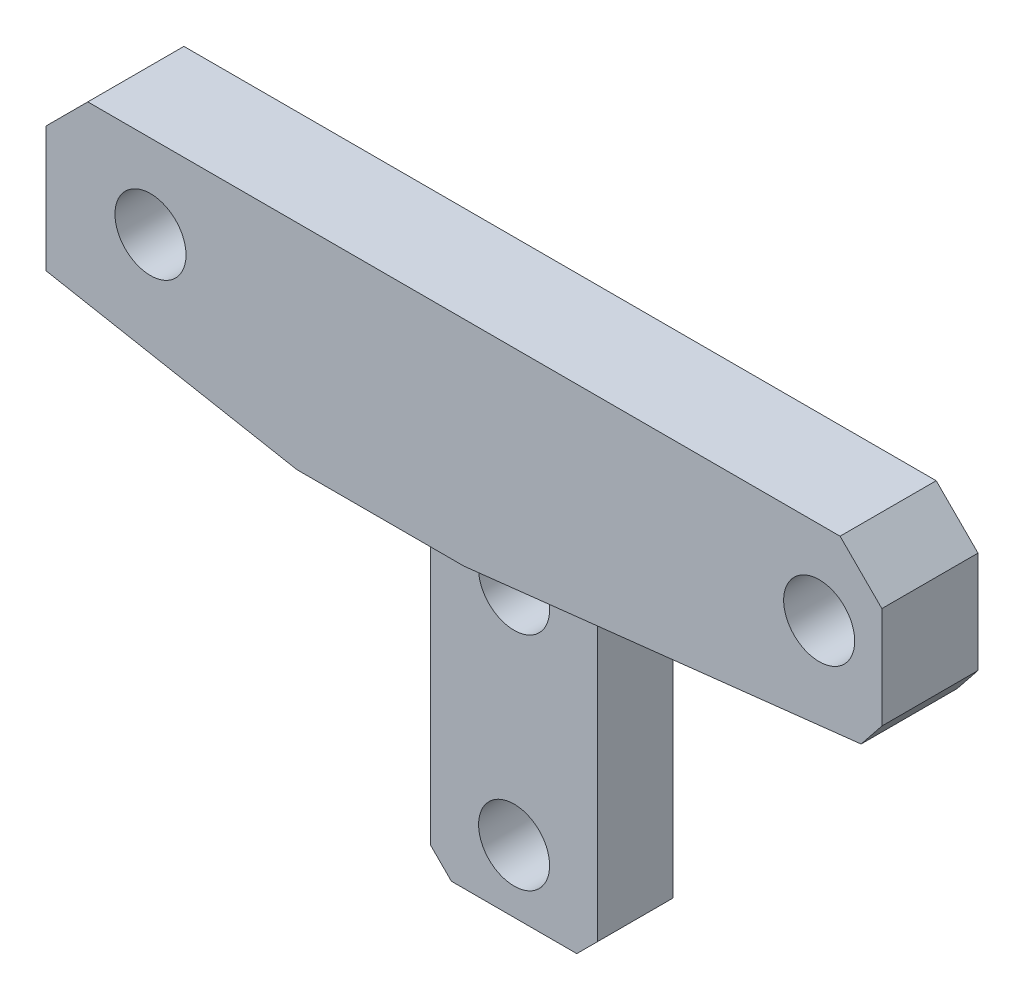
ISO-10303-21;
HEADER;
FILE_DESCRIPTION(('STEP AP214'),'2;1');
FILE_NAME('part.step','',(''),(''),'','','');
FILE_SCHEMA(('AUTOMOTIVE_DESIGN { 1 0 10303 214 1 1 1 1 }'));
ENDSEC;
DATA;
#1=APPLICATION_CONTEXT('core data for automotive mechanical design processes');
#2=APPLICATION_PROTOCOL_DEFINITION('international standard','automotive_design',2000,#1);
#3=PRODUCT_CONTEXT('',#1,'mechanical');
#4=PRODUCT('Part','Part','',(#3));
#5=PRODUCT_RELATED_PRODUCT_CATEGORY('part','',(#4));
#6=PRODUCT_DEFINITION_FORMATION('','',#4);
#7=PRODUCT_DEFINITION_CONTEXT('part definition',#1,'design');
#8=PRODUCT_DEFINITION('design','',#6,#7);
#9=PRODUCT_DEFINITION_SHAPE('','',#8);
#10=(LENGTH_UNIT() NAMED_UNIT(*) SI_UNIT(.MILLI.,.METRE.));
#11=(NAMED_UNIT(*) PLANE_ANGLE_UNIT() SI_UNIT($,.RADIAN.));
#12=(NAMED_UNIT(*) SI_UNIT($,.STERADIAN.) SOLID_ANGLE_UNIT());
#13=UNCERTAINTY_MEASURE_WITH_UNIT(LENGTH_MEASURE(1.E-05),#10,'distance_accuracy_value','');
#14=(GEOMETRIC_REPRESENTATION_CONTEXT(3) GLOBAL_UNCERTAINTY_ASSIGNED_CONTEXT((#13)) GLOBAL_UNIT_ASSIGNED_CONTEXT((#10,
#11,#12)) REPRESENTATION_CONTEXT('',''));
#15=CARTESIAN_POINT('',(0.,0.,0.));
#16=DIRECTION('',(0.,0.,1.));
#17=DIRECTION('',(1.,0.,0.));
#18=AXIS2_PLACEMENT_3D('',#15,#16,#17);
#19=CARTESIAN_POINT('',(0.,-3.12,5.5));
#20=DIRECTION('',(-0.111304076447319,0.993786396851059,0.));
#21=DIRECTION('',(-0.993786396851058,-0.111304076447319,0.));
#22=AXIS2_PLACEMENT_3D('',#19,#20,#21);
#23=PLANE('',#22);
#24=DIRECTION('',(-0.993786396851058,-0.111304076447319,0.));
#25=VECTOR('',#24,1.);
#26=CARTESIAN_POINT('',(5.53571428571428,-2.5,0.5));
#27=LINE('',#26,#25);
#28=CARTESIAN_POINT('',(5.53571428571428,-2.5,0.5));
#29=VERTEX_POINT('',#28);
#30=CARTESIAN_POINT('',(0.,-3.12,0.5));
#31=VERTEX_POINT('',#30);
#32=EDGE_CURVE('E280',#29,#31,#27,.T.);
#33=ORIENTED_EDGE('',*,*,#32,.F.);
#34=DIRECTION('',(0.,0.,-1.));
#35=VECTOR('',#34,1.);
#36=CARTESIAN_POINT('',(5.53571428571428,-2.5,5.5));
#37=LINE('',#36,#35);
#38=CARTESIAN_POINT('',(5.53571428571428,-2.5,3.2));
#39=VERTEX_POINT('',#38);
#40=EDGE_CURVE('E253',#39,#29,#37,.T.);
#41=ORIENTED_EDGE('',*,*,#40,.F.);
#42=DIRECTION('',(0.993786396851058,0.111304076447319,0.));
#43=VECTOR('',#42,1.);
#44=CARTESIAN_POINT('',(0.,-3.12,3.2));
#45=LINE('',#44,#43);
#46=CARTESIAN_POINT('',(9.50310680157448,-2.05565203822366,3.2));
#47=VERTEX_POINT('',#46);
#48=EDGE_CURVE('E244',#39,#47,#45,.T.);
#49=ORIENTED_EDGE('',*,*,#48,.T.);
#50=DIRECTION('',(0.,0.,1.));
#51=VECTOR('',#50,1.);
#52=CARTESIAN_POINT('',(9.50310680157448,-2.05565203822366,5.5));
#53=LINE('',#52,#51);
#54=CARTESIAN_POINT('',(9.50310680157448,-2.05565203822366,5.5));
#55=VERTEX_POINT('',#54);
#56=EDGE_CURVE('E54',#47,#55,#53,.T.);
#57=ORIENTED_EDGE('',*,*,#56,.T.);
#58=DIRECTION('',(0.993786396851058,0.111304076447319,0.));
#59=VECTOR('',#58,1.);
#60=CARTESIAN_POINT('',(0.,-3.12,5.5));
#61=LINE('',#60,#59);
#62=CARTESIAN_POINT('',(0.,-3.12,5.5));
#63=VERTEX_POINT('',#62);
#64=EDGE_CURVE('E262',#63,#55,#61,.T.);
#65=ORIENTED_EDGE('',*,*,#64,.F.);
#66=DIRECTION('',(0.,0.,-1.));
#67=VECTOR('',#66,1.);
#68=CARTESIAN_POINT('',(0.,-3.12,5.5));
#69=LINE('',#68,#67);
#70=CARTESIAN_POINT('',(0.,-3.12,3.30000000000001));
#71=VERTEX_POINT('',#70);
#72=EDGE_CURVE('E187',#63,#71,#69,.T.);
#73=ORIENTED_EDGE('',*,*,#72,.T.);
#74=EDGE_CURVE('E191',#71,#31,#69,.T.);
#75=ORIENTED_EDGE('',*,*,#74,.T.);
#76=EDGE_LOOP('',(#33,#41,#49,#57,#65,#73,#75));
#77=FACE_BOUND('',#76,.T.);
#78=ADVANCED_FACE('F45',(#77),#23,.F.);
#79=CARTESIAN_POINT('',(-9.99999999999999,-2.,5.5));
#80=DIRECTION('',(0.183497113102886,0.98302024876546,0.));
#81=DIRECTION('',(-0.98302024876546,0.183497113102886,0.));
#82=AXIS2_PLACEMENT_3D('',#79,#80,#81);
#83=PLANE('',#82);
#84=DIRECTION('',(-0.98302024876546,0.183497113102886,0.));
#85=VECTOR('',#84,1.);
#86=CARTESIAN_POINT('',(-4.,-3.12,0.5));
#87=LINE('',#86,#85);
#88=CARTESIAN_POINT('',(-4.,-3.12,0.5));
#89=VERTEX_POINT('',#88);
#90=CARTESIAN_POINT('',(-7.32142857142856,-2.5,0.5));
#91=VERTEX_POINT('',#90);
#92=EDGE_CURVE('E61',#89,#91,#87,.T.);
#93=ORIENTED_EDGE('',*,*,#92,.F.);
#94=DIRECTION('',(0.,0.,-1.));
#95=VECTOR('',#94,1.);
#96=CARTESIAN_POINT('',(-4.,-3.12,5.5));
#97=LINE('',#96,#95);
#98=CARTESIAN_POINT('',(-4.,-3.12,3.30000000000001));
#99=VERTEX_POINT('',#98);
#100=EDGE_CURVE('E175',#99,#89,#97,.T.);
#101=ORIENTED_EDGE('',*,*,#100,.F.);
#102=CARTESIAN_POINT('',(-4.,-3.12,5.5));
#103=VERTEX_POINT('',#102);
#104=EDGE_CURVE('E186',#103,#99,#97,.T.);
#105=ORIENTED_EDGE('',*,*,#104,.F.);
#106=DIRECTION('',(0.98302024876546,-0.183497113102886,0.));
#107=VECTOR('',#106,1.);
#108=CARTESIAN_POINT('',(-9.99999999999999,-2.,5.5));
#109=LINE('',#108,#107);
#110=CARTESIAN_POINT('',(-9.99999999999999,-2.,5.5));
#111=VERTEX_POINT('',#110);
#112=EDGE_CURVE('E276',#111,#103,#109,.T.);
#113=ORIENTED_EDGE('',*,*,#112,.F.);
#114=DIRECTION('',(0.,0.,-1.));
#115=VECTOR('',#114,1.);
#116=CARTESIAN_POINT('',(-9.99999999999999,-2.,5.5));
#117=LINE('',#116,#115);
#118=CARTESIAN_POINT('',(-9.99999999999999,-2.,3.2));
#119=VERTEX_POINT('',#118);
#120=EDGE_CURVE('E189',#111,#119,#117,.T.);
#121=ORIENTED_EDGE('',*,*,#120,.T.);
#122=DIRECTION('',(0.98302024876546,-0.183497113102886,0.));
#123=VECTOR('',#122,1.);
#124=CARTESIAN_POINT('',(-9.99999999999999,-2.,3.2));
#125=LINE('',#124,#123);
#126=CARTESIAN_POINT('',(-7.32142857142856,-2.5,3.2));
#127=VERTEX_POINT('',#126);
#128=EDGE_CURVE('E254',#119,#127,#125,.T.);
#129=ORIENTED_EDGE('',*,*,#128,.T.);
#130=DIRECTION('',(0.,0.,1.));
#131=VECTOR('',#130,1.);
#132=CARTESIAN_POINT('',(-7.32142857142856,-2.5,5.5));
#133=LINE('',#132,#131);
#134=EDGE_CURVE('E178',#91,#127,#133,.T.);
#135=ORIENTED_EDGE('',*,*,#134,.F.);
#136=EDGE_LOOP('',(#93,#101,#105,#113,#121,#129,#135));
#137=FACE_BOUND('',#136,.T.);
#138=ADVANCED_FACE('F173',(#137),#83,.F.);
#139=CARTESIAN_POINT('',(-4.,-3.12,5.5));
#140=DIRECTION('',(1.,0.,0.));
#141=DIRECTION('',(0.,1.,0.));
#142=AXIS2_PLACEMENT_3D('',#139,#140,#141);
#143=PLANE('',#142);
#144=DIRECTION('',(0.,1.,0.));
#145=VECTOR('',#144,1.);
#146=CARTESIAN_POINT('',(-4.,-12.5,0.5));
#147=LINE('',#146,#145);
#148=CARTESIAN_POINT('',(-4.,-12.5,0.5));
#149=VERTEX_POINT('',#148);
#150=EDGE_CURVE('E163',#149,#89,#147,.T.);
#151=ORIENTED_EDGE('',*,*,#150,.F.);
#152=DIRECTION('',(0.,0.,1.));
#153=VECTOR('',#152,1.);
#154=CARTESIAN_POINT('',(-4.,-12.5,5.5));
#155=LINE('',#154,#153);
#156=CARTESIAN_POINT('',(-4.,-12.5,2.3));
#157=VERTEX_POINT('',#156);
#158=EDGE_CURVE('E226',#149,#157,#155,.T.);
#159=ORIENTED_EDGE('',*,*,#158,.T.);
#160=DIRECTION('',(0.,1.,0.));
#161=VECTOR('',#160,1.);
#162=CARTESIAN_POINT('',(-4.,-13.,2.3));
#163=LINE('',#162,#161);
#164=CARTESIAN_POINT('',(-4.,-4.12,2.3));
#165=VERTEX_POINT('',#164);
#166=EDGE_CURVE('E322',#157,#165,#163,.T.);
#167=ORIENTED_EDGE('',*,*,#166,.T.);
#168=DIRECTION('',(0.,0.707106781186544,0.707106781186551));
#169=VECTOR('',#168,1.);
#170=CARTESIAN_POINT('',(-4.,-2.02,4.40000000000001));
#171=LINE('',#170,#169);
#172=EDGE_CURVE('E184',#165,#99,#171,.T.);
#173=ORIENTED_EDGE('',*,*,#172,.T.);
#174=ORIENTED_EDGE('',*,*,#100,.T.);
#175=EDGE_LOOP('',(#151,#159,#167,#173,#174));
#176=FACE_BOUND('',#175,.T.);
#177=ADVANCED_FACE('F182',(#176),#143,.F.);
#178=CARTESIAN_POINT('',(-4.,-13.,5.5));
#179=DIRECTION('',(0.,1.,0.));
#180=DIRECTION('',(0.,0.,1.));
#181=AXIS2_PLACEMENT_3D('',#178,#179,#180);
#182=PLANE('',#181);
#183=DIRECTION('',(-1.,0.,0.));
#184=VECTOR('',#183,1.);
#185=CARTESIAN_POINT('',(-0.500000000000006,-13.,0.5));
#186=LINE('',#185,#184);
#187=CARTESIAN_POINT('',(-0.500000000000006,-13.,0.5));
#188=VERTEX_POINT('',#187);
#189=CARTESIAN_POINT('',(-3.49999999999999,-13.,0.5));
#190=VERTEX_POINT('',#189);
#191=EDGE_CURVE('E401',#188,#190,#186,.T.);
#192=ORIENTED_EDGE('',*,*,#191,.F.);
#193=DIRECTION('',(0.,0.,1.));
#194=VECTOR('',#193,1.);
#195=CARTESIAN_POINT('',(-0.500000000000006,-13.,5.5));
#196=LINE('',#195,#194);
#197=CARTESIAN_POINT('',(-0.500000000000006,-13.,2.3));
#198=VERTEX_POINT('',#197);
#199=EDGE_CURVE('E221',#188,#198,#196,.T.);
#200=ORIENTED_EDGE('',*,*,#199,.T.);
#201=DIRECTION('',(-1.,0.,0.));
#202=VECTOR('',#201,1.);
#203=CARTESIAN_POINT('',(0.,-13.,2.3));
#204=LINE('',#203,#202);
#205=CARTESIAN_POINT('',(-3.49999999999999,-13.,2.3));
#206=VERTEX_POINT('',#205);
#207=EDGE_CURVE('E319',#198,#206,#204,.T.);
#208=ORIENTED_EDGE('',*,*,#207,.T.);
#209=DIRECTION('',(0.,0.,-1.));
#210=VECTOR('',#209,1.);
#211=CARTESIAN_POINT('',(-3.49999999999999,-13.,5.5));
#212=LINE('',#211,#210);
#213=EDGE_CURVE('E223',#206,#190,#212,.T.);
#214=ORIENTED_EDGE('',*,*,#213,.T.);
#215=EDGE_LOOP('',(#192,#200,#208,#214));
#216=FACE_BOUND('',#215,.T.);
#217=ADVANCED_FACE('F399',(#216),#182,.F.);
#218=CARTESIAN_POINT('',(0.,-3.12,5.5));
#219=DIRECTION('',(-1.,0.,0.));
#220=DIRECTION('',(0.,-1.,0.));
#221=AXIS2_PLACEMENT_3D('',#218,#219,#220);
#222=PLANE('',#221);
#223=DIRECTION('',(0.,-1.,0.));
#224=VECTOR('',#223,1.);
#225=CARTESIAN_POINT('',(0.,-3.12,0.5));
#226=LINE('',#225,#224);
#227=CARTESIAN_POINT('',(0.,-12.5,0.5));
#228=VERTEX_POINT('',#227);
#229=EDGE_CURVE('E287',#31,#228,#226,.T.);
#230=ORIENTED_EDGE('',*,*,#229,.F.);
#231=ORIENTED_EDGE('',*,*,#74,.F.);
#232=DIRECTION('',(0.,-0.707106781186544,-0.707106781186551));
#233=VECTOR('',#232,1.);
#234=CARTESIAN_POINT('',(0.,-2.02,4.40000000000001));
#235=LINE('',#234,#233);
#236=CARTESIAN_POINT('',(0.,-4.12,2.3));
#237=VERTEX_POINT('',#236);
#238=EDGE_CURVE('E203',#71,#237,#235,.T.);
#239=ORIENTED_EDGE('',*,*,#238,.T.);
#240=DIRECTION('',(0.,-1.,0.));
#241=VECTOR('',#240,1.);
#242=CARTESIAN_POINT('',(0.,-3.12,2.3));
#243=LINE('',#242,#241);
#244=CARTESIAN_POINT('',(0.,-12.5,2.3));
#245=VERTEX_POINT('',#244);
#246=EDGE_CURVE('E324',#237,#245,#243,.T.);
#247=ORIENTED_EDGE('',*,*,#246,.T.);
#248=DIRECTION('',(0.,0.,-1.));
#249=VECTOR('',#248,1.);
#250=CARTESIAN_POINT('',(0.,-12.5,5.5));
#251=LINE('',#250,#249);
#252=EDGE_CURVE('E232',#245,#228,#251,.T.);
#253=ORIENTED_EDGE('',*,*,#252,.T.);
#254=EDGE_LOOP('',(#230,#231,#239,#247,#253));
#255=FACE_BOUND('',#254,.T.);
#256=ADVANCED_FACE('F284',(#255),#222,.F.);
#257=CARTESIAN_POINT('',(-2.,-11.5,5.5));
#258=DIRECTION('',(0.,0.,-1.));
#259=DIRECTION('',(-1.,0.,0.));
#260=AXIS2_PLACEMENT_3D('',#257,#258,#259);
#261=CYLINDRICAL_SURFACE('',#260,0.85);
#262=CARTESIAN_POINT('',(-2.,-11.5,2.3));
#263=DIRECTION('',(0.,0.,-1.));
#264=DIRECTION('',(-1.,0.,0.));
#265=AXIS2_PLACEMENT_3D('',#262,#263,#264);
#266=CIRCLE('',#265,0.85);
#267=CARTESIAN_POINT('',(-2.85,-11.5,2.3));
#268=VERTEX_POINT('',#267);
#269=EDGE_CURVE('E316',#268,#268,#266,.T.);
#270=ORIENTED_EDGE('',*,*,#269,.F.);
#271=EDGE_LOOP('',(#270));
#272=FACE_BOUND('',#271,.T.);
#273=CARTESIAN_POINT('',(-2.,-11.5,0.5));
#274=DIRECTION('',(0.,0.,-1.));
#275=DIRECTION('',(-1.,0.,0.));
#276=AXIS2_PLACEMENT_3D('',#273,#274,#275);
#277=CIRCLE('',#276,0.85);
#278=CARTESIAN_POINT('',(-2.85,-11.5,0.5));
#279=VERTEX_POINT('',#278);
#280=EDGE_CURVE('E410',#279,#279,#277,.T.);
#281=ORIENTED_EDGE('',*,*,#280,.T.);
#282=EDGE_LOOP('',(#281));
#283=FACE_BOUND('',#282,.T.);
#284=ADVANCED_FACE('F441',(#272,#283),#261,.F.);
#285=CARTESIAN_POINT('',(-2.,-6.2,5.5));
#286=DIRECTION('',(0.,0.,-1.));
#287=DIRECTION('',(-1.,0.,0.));
#288=AXIS2_PLACEMENT_3D('',#285,#286,#287);
#289=CYLINDRICAL_SURFACE('',#288,0.85);
#290=CARTESIAN_POINT('',(-2.,-6.2,2.3));
#291=DIRECTION('',(0.,0.,-1.));
#292=DIRECTION('',(-1.,0.,0.));
#293=AXIS2_PLACEMENT_3D('',#290,#291,#292);
#294=CIRCLE('',#293,0.85);
#295=CARTESIAN_POINT('',(-2.85,-6.2,2.3));
#296=VERTEX_POINT('',#295);
#297=EDGE_CURVE('E313',#296,#296,#294,.T.);
#298=ORIENTED_EDGE('',*,*,#297,.F.);
#299=EDGE_LOOP('',(#298));
#300=FACE_BOUND('',#299,.T.);
#301=CARTESIAN_POINT('',(-2.,-6.2,0.5));
#302=DIRECTION('',(0.,0.,-1.));
#303=DIRECTION('',(-1.,0.,0.));
#304=AXIS2_PLACEMENT_3D('',#301,#302,#303);
#305=CIRCLE('',#304,0.85);
#306=CARTESIAN_POINT('',(-2.85,-6.2,0.5));
#307=VERTEX_POINT('',#306);
#308=EDGE_CURVE('E407',#307,#307,#305,.T.);
#309=ORIENTED_EDGE('',*,*,#308,.T.);
#310=EDGE_LOOP('',(#309));
#311=FACE_BOUND('',#310,.T.);
#312=ADVANCED_FACE('F383',(#300,#311),#289,.F.);
#313=CARTESIAN_POINT('',(-3.49999999999999,-13.,5.5));
#314=DIRECTION('',(0.70710678118655,0.707106781186545,0.));
#315=DIRECTION('',(0.,0.,-1.));
#316=AXIS2_PLACEMENT_3D('',#313,#314,#315);
#317=PLANE('',#316);
#318=ORIENTED_EDGE('',*,*,#158,.F.);
#319=DIRECTION('',(-0.707106781186545,0.70710678118655,0.));
#320=VECTOR('',#319,1.);
#321=CARTESIAN_POINT('',(-3.49999999999999,-13.,0.5));
#322=LINE('',#321,#320);
#323=EDGE_CURVE('E166',#190,#149,#322,.T.);
#324=ORIENTED_EDGE('',*,*,#323,.F.);
#325=ORIENTED_EDGE('',*,*,#213,.F.);
#326=DIRECTION('',(-0.707106781186545,0.70710678118655,0.));
#327=VECTOR('',#326,1.);
#328=CARTESIAN_POINT('',(-3.49999999999999,-13.,2.3));
#329=LINE('',#328,#327);
#330=EDGE_CURVE('E230',#157,#206,#329,.F.);
#331=ORIENTED_EDGE('',*,*,#330,.F.);
#332=EDGE_LOOP('',(#318,#324,#325,#331));
#333=FACE_BOUND('',#332,.T.);
#334=ADVANCED_FACE('F378',(#333),#317,.F.);
#335=CARTESIAN_POINT('',(0.,-12.5,5.5));
#336=DIRECTION('',(-0.707106781186544,0.707106781186551,0.));
#337=DIRECTION('',(0.,0.,-1.));
#338=AXIS2_PLACEMENT_3D('',#335,#336,#337);
#339=PLANE('',#338);
#340=ORIENTED_EDGE('',*,*,#199,.F.);
#341=DIRECTION('',(-0.707106781186551,-0.707106781186544,0.));
#342=VECTOR('',#341,1.);
#343=CARTESIAN_POINT('',(0.,-12.5,0.5));
#344=LINE('',#343,#342);
#345=EDGE_CURVE('E395',#228,#188,#344,.T.);
#346=ORIENTED_EDGE('',*,*,#345,.F.);
#347=ORIENTED_EDGE('',*,*,#252,.F.);
#348=DIRECTION('',(-0.707106781186551,-0.707106781186544,0.));
#349=VECTOR('',#348,1.);
#350=CARTESIAN_POINT('',(0.,-12.5,2.3));
#351=LINE('',#350,#349);
#352=EDGE_CURVE('E228',#198,#245,#351,.F.);
#353=ORIENTED_EDGE('',*,*,#352,.F.);
#354=EDGE_LOOP('',(#340,#346,#347,#353));
#355=FACE_BOUND('',#354,.T.);
#356=ADVANCED_FACE('F344',(#355),#339,.F.);
#357=CARTESIAN_POINT('',(-9.99999999999999,-2.5,3.2));
#358=DIRECTION('',(0.,1.,0.));
#359=DIRECTION('',(0.,0.,1.));
#360=AXIS2_PLACEMENT_3D('',#357,#358,#359);
#361=PLANE('',#360);
#362=ORIENTED_EDGE('',*,*,#40,.T.);
#363=DIRECTION('',(1.,0.,0.));
#364=VECTOR('',#363,1.);
#365=CARTESIAN_POINT('',(-7.32142857142856,-2.5,0.5));
#366=LINE('',#365,#364);
#367=EDGE_CURVE('E179',#91,#29,#366,.T.);
#368=ORIENTED_EDGE('',*,*,#367,.F.);
#369=ORIENTED_EDGE('',*,*,#134,.T.);
#370=DIRECTION('',(1.,0.,0.));
#371=VECTOR('',#370,1.);
#372=CARTESIAN_POINT('',(-9.99999999999999,-2.5,3.2));
#373=LINE('',#372,#371);
#374=EDGE_CURVE('E302',#127,#39,#373,.T.);
#375=ORIENTED_EDGE('',*,*,#374,.T.);
#376=EDGE_LOOP('',(#362,#368,#369,#375));
#377=FACE_BOUND('',#376,.T.);
#378=ADVANCED_FACE('F335',(#377),#361,.T.);
#379=CARTESIAN_POINT('',(0.,0.,5.5));
#380=DIRECTION('',(0.,0.,-1.));
#381=DIRECTION('',(-1.,0.,0.));
#382=AXIS2_PLACEMENT_3D('',#379,#380,#381);
#383=PLANE('',#382);
#384=CARTESIAN_POINT('',(8.5,0.,5.5));
#385=DIRECTION('',(0.,0.,1.));
#386=DIRECTION('',(1.,0.,0.));
#387=AXIS2_PLACEMENT_3D('',#384,#385,#386);
#388=CIRCLE('',#387,0.85);
#389=CARTESIAN_POINT('',(9.35,0.,5.5));
#390=VERTEX_POINT('',#389);
#391=EDGE_CURVE('E326',#390,#390,#388,.T.);
#392=ORIENTED_EDGE('',*,*,#391,.F.);
#393=EDGE_LOOP('',(#392));
#394=FACE_BOUND('',#393,.T.);
#395=CARTESIAN_POINT('',(-7.5,0.,5.5));
#396=DIRECTION('',(0.,0.,1.));
#397=DIRECTION('',(1.,0.,0.));
#398=AXIS2_PLACEMENT_3D('',#395,#396,#397);
#399=CIRCLE('',#398,0.85);
#400=CARTESIAN_POINT('',(-6.65,0.,5.5));
#401=VERTEX_POINT('',#400);
#402=EDGE_CURVE('E272',#401,#401,#399,.T.);
#403=ORIENTED_EDGE('',*,*,#402,.F.);
#404=EDGE_LOOP('',(#403));
#405=FACE_BOUND('',#404,.T.);
#406=ORIENTED_EDGE('',*,*,#64,.T.);
#407=DIRECTION('',(-0.624009233034728,-0.781416967493931,0.));
#408=VECTOR('',#407,1.);
#409=CARTESIAN_POINT('',(10.,-1.43341641136647,5.5));
#410=LINE('',#409,#408);
#411=CARTESIAN_POINT('',(10.,-1.43341641136647,5.5));
#412=VERTEX_POINT('',#411);
#413=EDGE_CURVE('E12',#55,#412,#410,.F.);
#414=ORIENTED_EDGE('',*,*,#413,.T.);
#415=DIRECTION('',(0.,1.,0.));
#416=VECTOR('',#415,1.);
#417=CARTESIAN_POINT('',(10.,2.,5.5));
#418=LINE('',#417,#416);
#419=CARTESIAN_POINT('',(10.,0.999999999999999,5.5));
#420=VERTEX_POINT('',#419);
#421=EDGE_CURVE('E260',#412,#420,#418,.T.);
#422=ORIENTED_EDGE('',*,*,#421,.T.);
#423=DIRECTION('',(0.707106781186546,-0.707106781186549,0.));
#424=VECTOR('',#423,1.);
#425=CARTESIAN_POINT('',(9.00000000000001,2.,5.5));
#426=LINE('',#425,#424);
#427=CARTESIAN_POINT('',(9.00000000000001,2.,5.5));
#428=VERTEX_POINT('',#427);
#429=EDGE_CURVE('E214',#420,#428,#426,.F.);
#430=ORIENTED_EDGE('',*,*,#429,.T.);
#431=DIRECTION('',(-1.,0.,0.));
#432=VECTOR('',#431,1.);
#433=CARTESIAN_POINT('',(-10.,2.,5.5));
#434=LINE('',#433,#432);
#435=CARTESIAN_POINT('',(-8.99999999999999,2.,5.5));
#436=VERTEX_POINT('',#435);
#437=EDGE_CURVE('E267',#428,#436,#434,.T.);
#438=ORIENTED_EDGE('',*,*,#437,.T.);
#439=DIRECTION('',(0.707106781186549,0.707106781186546,0.));
#440=VECTOR('',#439,1.);
#441=CARTESIAN_POINT('',(-10.,0.999999999999999,5.5));
#442=LINE('',#441,#440);
#443=CARTESIAN_POINT('',(-10.,0.999999999999998,5.5));
#444=VERTEX_POINT('',#443);
#445=EDGE_CURVE('E216',#436,#444,#442,.F.);
#446=ORIENTED_EDGE('',*,*,#445,.T.);
#447=DIRECTION('',(0.,-1.,0.));
#448=VECTOR('',#447,1.);
#449=CARTESIAN_POINT('',(-10.,2.,5.5));
#450=LINE('',#449,#448);
#451=EDGE_CURVE('E270',#444,#111,#450,.T.);
#452=ORIENTED_EDGE('',*,*,#451,.T.);
#453=ORIENTED_EDGE('',*,*,#112,.T.);
#454=DIRECTION('',(1.,0.,0.));
#455=VECTOR('',#454,1.);
#456=CARTESIAN_POINT('',(0.,-3.12,5.5));
#457=LINE('',#456,#455);
#458=EDGE_CURVE('E293',#103,#63,#457,.T.);
#459=ORIENTED_EDGE('',*,*,#458,.T.);
#460=EDGE_LOOP('',(#406,#414,#422,#430,#438,#446,#452,#453,#459));
#461=FACE_BOUND('',#460,.T.);
#462=ADVANCED_FACE('F259',(#394,#405,#461),#383,.F.);
#463=CARTESIAN_POINT('',(10.,2.,5.5));
#464=DIRECTION('',(-1.,0.,0.));
#465=DIRECTION('',(0.,-1.,0.));
#466=AXIS2_PLACEMENT_3D('',#463,#464,#465);
#467=PLANE('',#466);
#468=ORIENTED_EDGE('',*,*,#421,.F.);
#469=DIRECTION('',(0.,0.,-1.));
#470=VECTOR('',#469,1.);
#471=CARTESIAN_POINT('',(10.,-1.43341641136647,5.5));
#472=LINE('',#471,#470);
#473=CARTESIAN_POINT('',(10.,-1.43341641136647,3.2));
#474=VERTEX_POINT('',#473);
#475=EDGE_CURVE('E236',#412,#474,#472,.T.);
#476=ORIENTED_EDGE('',*,*,#475,.T.);
#477=DIRECTION('',(0.,1.,0.));
#478=VECTOR('',#477,1.);
#479=CARTESIAN_POINT('',(10.,-2.5,3.2));
#480=LINE('',#479,#478);
#481=CARTESIAN_POINT('',(10.,0.999999999999999,3.2));
#482=VERTEX_POINT('',#481);
#483=EDGE_CURVE('E247',#474,#482,#480,.T.);
#484=ORIENTED_EDGE('',*,*,#483,.T.);
#485=DIRECTION('',(0.,0.,1.));
#486=VECTOR('',#485,1.);
#487=CARTESIAN_POINT('',(10.,0.999999999999999,5.5));
#488=LINE('',#487,#486);
#489=EDGE_CURVE('E218',#482,#420,#488,.T.);
#490=ORIENTED_EDGE('',*,*,#489,.T.);
#491=EDGE_LOOP('',(#468,#476,#484,#490));
#492=FACE_BOUND('',#491,.T.);
#493=ADVANCED_FACE('F264',(#492),#467,.F.);
#494=CARTESIAN_POINT('',(-10.,2.,5.5));
#495=DIRECTION('',(0.,-1.,0.));
#496=DIRECTION('',(0.,0.,-1.));
#497=AXIS2_PLACEMENT_3D('',#494,#495,#496);
#498=PLANE('',#497);
#499=DIRECTION('',(0.,0.,-1.));
#500=VECTOR('',#499,1.);
#501=CARTESIAN_POINT('',(9.00000000000001,2.,5.5));
#502=LINE('',#501,#500);
#503=CARTESIAN_POINT('',(9.00000000000001,2.,3.2));
#504=VERTEX_POINT('',#503);
#505=EDGE_CURVE('E209',#428,#504,#502,.T.);
#506=ORIENTED_EDGE('',*,*,#505,.T.);
#507=DIRECTION('',(-1.,0.,0.));
#508=VECTOR('',#507,1.);
#509=CARTESIAN_POINT('',(9.00000000000001,2.,3.2));
#510=LINE('',#509,#508);
#511=CARTESIAN_POINT('',(-8.99999999999999,2.,3.2));
#512=VERTEX_POINT('',#511);
#513=EDGE_CURVE('E306',#504,#512,#510,.T.);
#514=ORIENTED_EDGE('',*,*,#513,.T.);
#515=DIRECTION('',(0.,0.,1.));
#516=VECTOR('',#515,1.);
#517=CARTESIAN_POINT('',(-8.99999999999999,2.,5.5));
#518=LINE('',#517,#516);
#519=EDGE_CURVE('E212',#512,#436,#518,.T.);
#520=ORIENTED_EDGE('',*,*,#519,.T.);
#521=ORIENTED_EDGE('',*,*,#437,.F.);
#522=EDGE_LOOP('',(#506,#514,#520,#521));
#523=FACE_BOUND('',#522,.T.);
#524=ADVANCED_FACE('F342',(#523),#498,.F.);
#525=CARTESIAN_POINT('',(-10.,2.,5.5));
#526=DIRECTION('',(1.,0.,0.));
#527=DIRECTION('',(0.,1.,0.));
#528=AXIS2_PLACEMENT_3D('',#525,#526,#527);
#529=PLANE('',#528);
#530=DIRECTION('',(0.,0.,-1.));
#531=VECTOR('',#530,1.);
#532=CARTESIAN_POINT('',(-10.,0.999999999999998,5.5));
#533=LINE('',#532,#531);
#534=CARTESIAN_POINT('',(-10.,0.999999999999998,3.2));
#535=VERTEX_POINT('',#534);
#536=EDGE_CURVE('E206',#444,#535,#533,.T.);
#537=ORIENTED_EDGE('',*,*,#536,.T.);
#538=DIRECTION('',(0.,-1.,0.));
#539=VECTOR('',#538,1.);
#540=CARTESIAN_POINT('',(-10.,0.999999999999998,3.2));
#541=LINE('',#540,#539);
#542=EDGE_CURVE('E300',#535,#119,#541,.T.);
#543=ORIENTED_EDGE('',*,*,#542,.T.);
#544=ORIENTED_EDGE('',*,*,#120,.F.);
#545=ORIENTED_EDGE('',*,*,#451,.F.);
#546=EDGE_LOOP('',(#537,#543,#544,#545));
#547=FACE_BOUND('',#546,.T.);
#548=ADVANCED_FACE('F298',(#547),#529,.F.);
#549=CARTESIAN_POINT('',(-7.5,0.,5.5));
#550=DIRECTION('',(0.,0.,-1.));
#551=DIRECTION('',(-1.,0.,0.));
#552=AXIS2_PLACEMENT_3D('',#549,#550,#551);
#553=CYLINDRICAL_SURFACE('',#552,0.85);
#554=CARTESIAN_POINT('',(-7.5,0.,3.2));
#555=DIRECTION('',(0.,0.,1.));
#556=DIRECTION('',(1.,0.,0.));
#557=AXIS2_PLACEMENT_3D('',#554,#555,#556);
#558=CIRCLE('',#557,0.85);
#559=CARTESIAN_POINT('',(-6.65,0.,3.2));
#560=VERTEX_POINT('',#559);
#561=EDGE_CURVE('E417',#560,#560,#558,.T.);
#562=ORIENTED_EDGE('',*,*,#561,.F.);
#563=EDGE_LOOP('',(#562));
#564=FACE_BOUND('',#563,.T.);
#565=ORIENTED_EDGE('',*,*,#402,.T.);
#566=EDGE_LOOP('',(#565));
#567=FACE_BOUND('',#566,.T.);
#568=ADVANCED_FACE('F332',(#564,#567),#553,.F.);
#569=CARTESIAN_POINT('',(8.5,0.,5.5));
#570=DIRECTION('',(0.,0.,-1.));
#571=DIRECTION('',(-1.,0.,0.));
#572=AXIS2_PLACEMENT_3D('',#569,#570,#571);
#573=CYLINDRICAL_SURFACE('',#572,0.85);
#574=CARTESIAN_POINT('',(8.5,0.,3.2));
#575=DIRECTION('',(0.,0.,1.));
#576=DIRECTION('',(1.,0.,0.));
#577=AXIS2_PLACEMENT_3D('',#574,#575,#576);
#578=CIRCLE('',#577,0.85);
#579=CARTESIAN_POINT('',(9.35,0.,3.2));
#580=VERTEX_POINT('',#579);
#581=EDGE_CURVE('E420',#580,#580,#578,.T.);
#582=ORIENTED_EDGE('',*,*,#581,.F.);
#583=EDGE_LOOP('',(#582));
#584=FACE_BOUND('',#583,.T.);
#585=ORIENTED_EDGE('',*,*,#391,.T.);
#586=EDGE_LOOP('',(#585));
#587=FACE_BOUND('',#586,.T.);
#588=ADVANCED_FACE('F456',(#584,#587),#573,.F.);
#589=CARTESIAN_POINT('',(0.,0.,2.3));
#590=DIRECTION('',(0.,0.,-1.));
#591=DIRECTION('',(-1.,0.,0.));
#592=AXIS2_PLACEMENT_3D('',#589,#590,#591);
#593=PLANE('',#592);
#594=ORIENTED_EDGE('',*,*,#269,.T.);
#595=EDGE_LOOP('',(#594));
#596=FACE_BOUND('',#595,.T.);
#597=ORIENTED_EDGE('',*,*,#166,.F.);
#598=ORIENTED_EDGE('',*,*,#330,.T.);
#599=ORIENTED_EDGE('',*,*,#207,.F.);
#600=ORIENTED_EDGE('',*,*,#352,.T.);
#601=ORIENTED_EDGE('',*,*,#246,.F.);
#602=DIRECTION('',(-1.,0.,0.));
#603=VECTOR('',#602,1.);
#604=CARTESIAN_POINT('',(0.,-4.12,2.3));
#605=LINE('',#604,#603);
#606=EDGE_CURVE('E200',#237,#165,#605,.T.);
#607=ORIENTED_EDGE('',*,*,#606,.T.);
#608=EDGE_LOOP('',(#597,#598,#599,#600,#601,#607));
#609=FACE_BOUND('',#608,.T.);
#610=ORIENTED_EDGE('',*,*,#297,.T.);
#611=EDGE_LOOP('',(#610));
#612=FACE_BOUND('',#611,.T.);
#613=ADVANCED_FACE('F404',(#596,#609,#612),#593,.F.);
#614=CARTESIAN_POINT('',(0.,-3.12,2.3));
#615=DIRECTION('',(0.,-1.,0.));
#616=DIRECTION('',(0.,0.,-1.));
#617=AXIS2_PLACEMENT_3D('',#614,#615,#616);
#618=PLANE('',#617);
#619=ORIENTED_EDGE('',*,*,#104,.T.);
#620=DIRECTION('',(1.,0.,0.));
#621=VECTOR('',#620,1.);
#622=CARTESIAN_POINT('',(0.,-3.12,3.30000000000001));
#623=LINE('',#622,#621);
#624=EDGE_CURVE('E197',#99,#71,#623,.T.);
#625=ORIENTED_EDGE('',*,*,#624,.T.);
#626=ORIENTED_EDGE('',*,*,#72,.F.);
#627=ORIENTED_EDGE('',*,*,#458,.F.);
#628=EDGE_LOOP('',(#619,#625,#626,#627));
#629=FACE_BOUND('',#628,.T.);
#630=ADVANCED_FACE('F292',(#629),#618,.T.);
#631=CARTESIAN_POINT('',(0.,-3.12,3.30000000000001));
#632=DIRECTION('',(0.,0.707106781186551,-0.707106781186544));
#633=DIRECTION('',(1.,0.,0.));
#634=AXIS2_PLACEMENT_3D('',#631,#632,#633);
#635=PLANE('',#634);
#636=ORIENTED_EDGE('',*,*,#172,.F.);
#637=ORIENTED_EDGE('',*,*,#606,.F.);
#638=ORIENTED_EDGE('',*,*,#238,.F.);
#639=ORIENTED_EDGE('',*,*,#624,.F.);
#640=EDGE_LOOP('',(#636,#637,#638,#639));
#641=FACE_BOUND('',#640,.T.);
#642=ADVANCED_FACE('F290',(#641),#635,.F.);
#643=CARTESIAN_POINT('',(-10.,0.999999999999999,5.5));
#644=DIRECTION('',(0.707106781186546,-0.707106781186549,0.));
#645=DIRECTION('',(0.,0.,-1.));
#646=AXIS2_PLACEMENT_3D('',#643,#644,#645);
#647=PLANE('',#646);
#648=DIRECTION('',(-0.707106781186548,-0.707106781186547,0.));
#649=VECTOR('',#648,1.);
#650=CARTESIAN_POINT('',(-8.99999999999999,2.,3.2));
#651=LINE('',#650,#649);
#652=EDGE_CURVE('E303',#512,#535,#651,.T.);
#653=ORIENTED_EDGE('',*,*,#652,.T.);
#654=ORIENTED_EDGE('',*,*,#536,.F.);
#655=ORIENTED_EDGE('',*,*,#445,.F.);
#656=ORIENTED_EDGE('',*,*,#519,.F.);
#657=EDGE_LOOP('',(#653,#654,#655,#656));
#658=FACE_BOUND('',#657,.T.);
#659=ADVANCED_FACE('F364',(#658),#647,.F.);
#660=CARTESIAN_POINT('',(9.00000000000001,2.,5.5));
#661=DIRECTION('',(-0.707106781186549,-0.707106781186546,0.));
#662=DIRECTION('',(0.,0.,-1.));
#663=AXIS2_PLACEMENT_3D('',#660,#661,#662);
#664=PLANE('',#663);
#665=DIRECTION('',(-0.707106781186546,0.707106781186549,0.));
#666=VECTOR('',#665,1.);
#667=CARTESIAN_POINT('',(10.,0.999999999999999,3.2));
#668=LINE('',#667,#666);
#669=EDGE_CURVE('E423',#482,#504,#668,.T.);
#670=ORIENTED_EDGE('',*,*,#669,.T.);
#671=ORIENTED_EDGE('',*,*,#505,.F.);
#672=ORIENTED_EDGE('',*,*,#429,.F.);
#673=ORIENTED_EDGE('',*,*,#489,.F.);
#674=EDGE_LOOP('',(#670,#671,#672,#673));
#675=FACE_BOUND('',#674,.T.);
#676=ADVANCED_FACE('F370',(#675),#664,.F.);
#677=CARTESIAN_POINT('',(0.,0.,3.2));
#678=DIRECTION('',(0.,0.,1.));
#679=DIRECTION('',(1.,0.,0.));
#680=AXIS2_PLACEMENT_3D('',#677,#678,#679);
#681=PLANE('',#680);
#682=ORIENTED_EDGE('',*,*,#581,.T.);
#683=EDGE_LOOP('',(#682));
#684=FACE_BOUND('',#683,.T.);
#685=ORIENTED_EDGE('',*,*,#561,.T.);
#686=EDGE_LOOP('',(#685));
#687=FACE_BOUND('',#686,.T.);
#688=ORIENTED_EDGE('',*,*,#483,.F.);
#689=DIRECTION('',(0.624009233034728,0.781416967493931,0.));
#690=VECTOR('',#689,1.);
#691=CARTESIAN_POINT('',(10.,-1.43341641136647,3.2));
#692=LINE('',#691,#690);
#693=EDGE_CURVE('E239',#474,#47,#692,.F.);
#694=ORIENTED_EDGE('',*,*,#693,.T.);
#695=ORIENTED_EDGE('',*,*,#48,.F.);
#696=ORIENTED_EDGE('',*,*,#374,.F.);
#697=ORIENTED_EDGE('',*,*,#128,.F.);
#698=ORIENTED_EDGE('',*,*,#542,.F.);
#699=ORIENTED_EDGE('',*,*,#652,.F.);
#700=ORIENTED_EDGE('',*,*,#513,.F.);
#701=ORIENTED_EDGE('',*,*,#669,.F.);
#702=EDGE_LOOP('',(#688,#694,#695,#696,#697,#698,#699,#700,#701));
#703=FACE_BOUND('',#702,.T.);
#704=ADVANCED_FACE('F242',(#684,#687,#703),#681,.F.);
#705=CARTESIAN_POINT('',(10.,-1.43341641136647,5.5));
#706=DIRECTION('',(-0.781416967493931,0.624009233034728,0.));
#707=DIRECTION('',(0.,0.,-1.));
#708=AXIS2_PLACEMENT_3D('',#705,#706,#707);
#709=PLANE('',#708);
#710=ORIENTED_EDGE('',*,*,#413,.F.);
#711=ORIENTED_EDGE('',*,*,#56,.F.);
#712=ORIENTED_EDGE('',*,*,#693,.F.);
#713=ORIENTED_EDGE('',*,*,#475,.F.);
#714=EDGE_LOOP('',(#710,#711,#712,#713));
#715=FACE_BOUND('',#714,.T.);
#716=ADVANCED_FACE('F48',(#715),#709,.F.);
#717=CARTESIAN_POINT('',(0.,0.,0.5));
#718=DIRECTION('',(0.,0.,-1.));
#719=DIRECTION('',(-1.,0.,0.));
#720=AXIS2_PLACEMENT_3D('',#717,#718,#719);
#721=PLANE('',#720);
#722=ORIENTED_EDGE('',*,*,#280,.F.);
#723=EDGE_LOOP('',(#722));
#724=FACE_BOUND('',#723,.T.);
#725=ORIENTED_EDGE('',*,*,#308,.F.);
#726=EDGE_LOOP('',(#725));
#727=FACE_BOUND('',#726,.T.);
#728=ORIENTED_EDGE('',*,*,#150,.T.);
#729=ORIENTED_EDGE('',*,*,#92,.T.);
#730=ORIENTED_EDGE('',*,*,#367,.T.);
#731=ORIENTED_EDGE('',*,*,#32,.T.);
#732=ORIENTED_EDGE('',*,*,#229,.T.);
#733=ORIENTED_EDGE('',*,*,#345,.T.);
#734=ORIENTED_EDGE('',*,*,#191,.T.);
#735=ORIENTED_EDGE('',*,*,#323,.T.);
#736=EDGE_LOOP('',(#728,#729,#730,#731,#732,#733,#734,#735));
#737=FACE_BOUND('',#736,.T.);
#738=ADVANCED_FACE('F164',(#724,#727,#737),#721,.T.);
#739=CLOSED_SHELL('',(#78,#138,#177,#217,#256,#284,#312,#334,#356,#378,#462,#493,#524,#548,#568,
#588,#613,#630,#642,#659,#676,#704,#716,#738));
#740=MANIFOLD_SOLID_BREP('B2',#739);
#741=ADVANCED_BREP_SHAPE_REPRESENTATION('',(#18,#740),#14);
#742=SHAPE_DEFINITION_REPRESENTATION(#9,#741);
ENDSEC;
END-ISO-10303-21;
